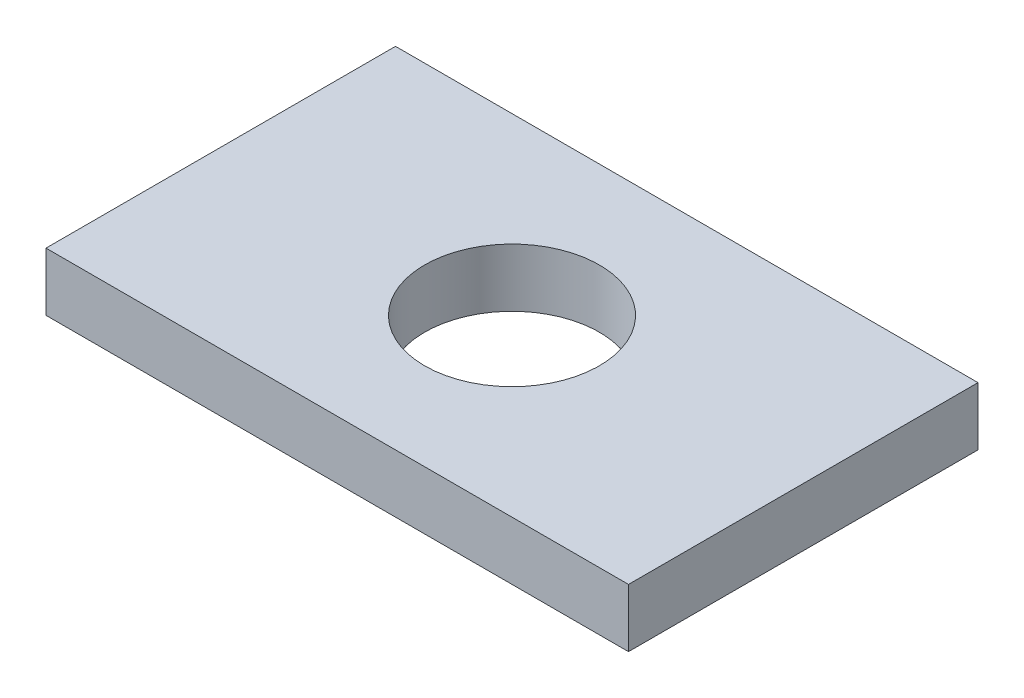
ISO-10303-21;
HEADER;
FILE_DESCRIPTION(('STEP AP214'),'2;1');
FILE_NAME('part.step','',(''),(''),'','','');
FILE_SCHEMA(('AUTOMOTIVE_DESIGN { 1 0 10303 214 1 1 1 1 }'));
ENDSEC;
DATA;
#1=APPLICATION_CONTEXT('core data for automotive mechanical design processes');
#2=APPLICATION_PROTOCOL_DEFINITION('international standard','automotive_design',2000,#1);
#3=PRODUCT_CONTEXT('',#1,'mechanical');
#4=PRODUCT('Part','Part','',(#3));
#5=PRODUCT_RELATED_PRODUCT_CATEGORY('part','',(#4));
#6=PRODUCT_DEFINITION_FORMATION('','',#4);
#7=PRODUCT_DEFINITION_CONTEXT('part definition',#1,'design');
#8=PRODUCT_DEFINITION('design','',#6,#7);
#9=PRODUCT_DEFINITION_SHAPE('','',#8);
#10=(LENGTH_UNIT() NAMED_UNIT(*) SI_UNIT(.MILLI.,.METRE.));
#11=(NAMED_UNIT(*) PLANE_ANGLE_UNIT() SI_UNIT($,.RADIAN.));
#12=(NAMED_UNIT(*) SI_UNIT($,.STERADIAN.) SOLID_ANGLE_UNIT());
#13=UNCERTAINTY_MEASURE_WITH_UNIT(LENGTH_MEASURE(1.E-05),#10,'distance_accuracy_value','');
#14=(GEOMETRIC_REPRESENTATION_CONTEXT(3) GLOBAL_UNCERTAINTY_ASSIGNED_CONTEXT((#13)) GLOBAL_UNIT_ASSIGNED_CONTEXT((#10,
#11,#12)) REPRESENTATION_CONTEXT('',''));
#15=CARTESIAN_POINT('',(0.,0.,0.));
#16=DIRECTION('',(0.,0.,1.));
#17=DIRECTION('',(1.,0.,0.));
#18=AXIS2_PLACEMENT_3D('',#15,#16,#17);
#19=CARTESIAN_POINT('',(0.,2.,0.));
#20=DIRECTION('',(0.,-1.,0.));
#21=DIRECTION('',(0.,0.,-1.));
#22=AXIS2_PLACEMENT_3D('',#19,#20,#21);
#23=PLANE('',#22);
#24=DIRECTION('',(0.,0.,1.));
#25=VECTOR('',#24,1.);
#26=CARTESIAN_POINT('',(0.,2.,0.));
#27=LINE('',#26,#25);
#28=CARTESIAN_POINT('',(0.,2.,-12.));
#29=VERTEX_POINT('',#28);
#30=CARTESIAN_POINT('',(0.,2.,0.));
#31=VERTEX_POINT('',#30);
#32=EDGE_CURVE('E85',#29,#31,#27,.T.);
#33=ORIENTED_EDGE('',*,*,#32,.T.);
#34=DIRECTION('',(1.,0.,0.));
#35=VECTOR('',#34,1.);
#36=CARTESIAN_POINT('',(0.,2.,0.));
#37=LINE('',#36,#35);
#38=CARTESIAN_POINT('',(20.,2.,0.));
#39=VERTEX_POINT('',#38);
#40=EDGE_CURVE('E80',#31,#39,#37,.T.);
#41=ORIENTED_EDGE('',*,*,#40,.T.);
#42=DIRECTION('',(0.,0.,-1.));
#43=VECTOR('',#42,1.);
#44=CARTESIAN_POINT('',(20.,2.,0.));
#45=LINE('',#44,#43);
#46=CARTESIAN_POINT('',(20.,2.,-12.));
#47=VERTEX_POINT('',#46);
#48=EDGE_CURVE('E83',#39,#47,#45,.T.);
#49=ORIENTED_EDGE('',*,*,#48,.T.);
#50=DIRECTION('',(-1.,0.,0.));
#51=VECTOR('',#50,1.);
#52=CARTESIAN_POINT('',(0.,2.,-12.));
#53=LINE('',#52,#51);
#54=EDGE_CURVE('E50',#47,#29,#53,.T.);
#55=ORIENTED_EDGE('',*,*,#54,.T.);
#56=EDGE_LOOP('',(#33,#41,#49,#55));
#57=FACE_BOUND('',#56,.T.);
#58=CARTESIAN_POINT('',(10.,2.,-6.));
#59=DIRECTION('',(0.,1.,0.));
#60=DIRECTION('',(0.,0.,1.));
#61=AXIS2_PLACEMENT_3D('',#58,#59,#60);
#62=CIRCLE('',#61,3.);
#63=CARTESIAN_POINT('',(10.,2.,-3.));
#64=VERTEX_POINT('',#63);
#65=EDGE_CURVE('E100',#64,#64,#62,.T.);
#66=ORIENTED_EDGE('',*,*,#65,.F.);
#67=EDGE_LOOP('',(#66));
#68=FACE_BOUND('',#67,.T.);
#69=ADVANCED_FACE('F33',(#57,#68),#23,.F.);
#70=CARTESIAN_POINT('',(0.,0.,0.));
#71=DIRECTION('',(0.,-1.,0.));
#72=DIRECTION('',(0.,0.,-1.));
#73=AXIS2_PLACEMENT_3D('',#70,#71,#72);
#74=PLANE('',#73);
#75=DIRECTION('',(0.,0.,1.));
#76=VECTOR('',#75,1.);
#77=CARTESIAN_POINT('',(0.,0.,0.));
#78=LINE('',#77,#76);
#79=CARTESIAN_POINT('',(0.,0.,-12.));
#80=VERTEX_POINT('',#79);
#81=CARTESIAN_POINT('',(0.,0.,0.));
#82=VERTEX_POINT('',#81);
#83=EDGE_CURVE('E97',#80,#82,#78,.T.);
#84=ORIENTED_EDGE('',*,*,#83,.F.);
#85=DIRECTION('',(-1.,0.,0.));
#86=VECTOR('',#85,1.);
#87=CARTESIAN_POINT('',(0.,0.,-12.));
#88=LINE('',#87,#86);
#89=CARTESIAN_POINT('',(20.,0.,-12.));
#90=VERTEX_POINT('',#89);
#91=EDGE_CURVE('E73',#90,#80,#88,.T.);
#92=ORIENTED_EDGE('',*,*,#91,.F.);
#93=DIRECTION('',(0.,0.,-1.));
#94=VECTOR('',#93,1.);
#95=CARTESIAN_POINT('',(20.,0.,0.));
#96=LINE('',#95,#94);
#97=CARTESIAN_POINT('',(20.,0.,0.));
#98=VERTEX_POINT('',#97);
#99=EDGE_CURVE('E67',#98,#90,#96,.T.);
#100=ORIENTED_EDGE('',*,*,#99,.F.);
#101=DIRECTION('',(1.,0.,0.));
#102=VECTOR('',#101,1.);
#103=CARTESIAN_POINT('',(0.,0.,0.));
#104=LINE('',#103,#102);
#105=EDGE_CURVE('E89',#82,#98,#104,.T.);
#106=ORIENTED_EDGE('',*,*,#105,.F.);
#107=EDGE_LOOP('',(#84,#92,#100,#106));
#108=FACE_BOUND('',#107,.T.);
#109=CARTESIAN_POINT('',(10.,0.,-6.));
#110=DIRECTION('',(0.,1.,0.));
#111=DIRECTION('',(0.,0.,1.));
#112=AXIS2_PLACEMENT_3D('',#109,#110,#111);
#113=CIRCLE('',#112,3.);
#114=CARTESIAN_POINT('',(10.,0.,-3.));
#115=VERTEX_POINT('',#114);
#116=EDGE_CURVE('E112',#115,#115,#113,.T.);
#117=ORIENTED_EDGE('',*,*,#116,.T.);
#118=EDGE_LOOP('',(#117));
#119=FACE_BOUND('',#118,.T.);
#120=ADVANCED_FACE('F108',(#108,#119),#74,.T.);
#121=CARTESIAN_POINT('',(0.,2.,0.));
#122=DIRECTION('',(1.,0.,0.));
#123=DIRECTION('',(0.,0.,-1.));
#124=AXIS2_PLACEMENT_3D('',#121,#122,#123);
#125=PLANE('',#124);
#126=ORIENTED_EDGE('',*,*,#83,.T.);
#127=DIRECTION('',(0.,-1.,0.));
#128=VECTOR('',#127,1.);
#129=CARTESIAN_POINT('',(0.,2.,0.));
#130=LINE('',#129,#128);
#131=EDGE_CURVE('E11',#31,#82,#130,.T.);
#132=ORIENTED_EDGE('',*,*,#131,.F.);
#133=ORIENTED_EDGE('',*,*,#32,.F.);
#134=DIRECTION('',(0.,-1.,0.));
#135=VECTOR('',#134,1.);
#136=CARTESIAN_POINT('',(0.,2.,-12.));
#137=LINE('',#136,#135);
#138=EDGE_CURVE('E93',#29,#80,#137,.T.);
#139=ORIENTED_EDGE('',*,*,#138,.T.);
#140=EDGE_LOOP('',(#126,#132,#133,#139));
#141=FACE_BOUND('',#140,.T.);
#142=ADVANCED_FACE('F35',(#141),#125,.F.);
#143=CARTESIAN_POINT('',(0.,2.,0.));
#144=DIRECTION('',(0.,0.,-1.));
#145=DIRECTION('',(-1.,0.,0.));
#146=AXIS2_PLACEMENT_3D('',#143,#144,#145);
#147=PLANE('',#146);
#148=ORIENTED_EDGE('',*,*,#105,.T.);
#149=DIRECTION('',(0.,-1.,0.));
#150=VECTOR('',#149,1.);
#151=CARTESIAN_POINT('',(20.,2.,0.));
#152=LINE('',#151,#150);
#153=EDGE_CURVE('E42',#39,#98,#152,.T.);
#154=ORIENTED_EDGE('',*,*,#153,.F.);
#155=ORIENTED_EDGE('',*,*,#40,.F.);
#156=ORIENTED_EDGE('',*,*,#131,.T.);
#157=EDGE_LOOP('',(#148,#154,#155,#156));
#158=FACE_BOUND('',#157,.T.);
#159=ADVANCED_FACE('F88',(#158),#147,.F.);
#160=CARTESIAN_POINT('',(20.,2.,0.));
#161=DIRECTION('',(-1.,0.,0.));
#162=DIRECTION('',(0.,0.,1.));
#163=AXIS2_PLACEMENT_3D('',#160,#161,#162);
#164=PLANE('',#163);
#165=ORIENTED_EDGE('',*,*,#99,.T.);
#166=DIRECTION('',(0.,-1.,0.));
#167=VECTOR('',#166,1.);
#168=CARTESIAN_POINT('',(20.,2.,-12.));
#169=LINE('',#168,#167);
#170=EDGE_CURVE('E90',#47,#90,#169,.T.);
#171=ORIENTED_EDGE('',*,*,#170,.F.);
#172=ORIENTED_EDGE('',*,*,#48,.F.);
#173=ORIENTED_EDGE('',*,*,#153,.T.);
#174=EDGE_LOOP('',(#165,#171,#172,#173));
#175=FACE_BOUND('',#174,.T.);
#176=ADVANCED_FACE('F91',(#175),#164,.F.);
#177=CARTESIAN_POINT('',(0.,2.,-12.));
#178=DIRECTION('',(0.,0.,1.));
#179=DIRECTION('',(1.,0.,0.));
#180=AXIS2_PLACEMENT_3D('',#177,#178,#179);
#181=PLANE('',#180);
#182=ORIENTED_EDGE('',*,*,#91,.T.);
#183=ORIENTED_EDGE('',*,*,#138,.F.);
#184=ORIENTED_EDGE('',*,*,#54,.F.);
#185=ORIENTED_EDGE('',*,*,#170,.T.);
#186=EDGE_LOOP('',(#182,#183,#184,#185));
#187=FACE_BOUND('',#186,.T.);
#188=ADVANCED_FACE('F105',(#187),#181,.F.);
#189=CARTESIAN_POINT('',(10.,2.,-6.));
#190=DIRECTION('',(0.,-1.,0.));
#191=DIRECTION('',(0.,0.,-1.));
#192=AXIS2_PLACEMENT_3D('',#189,#190,#191);
#193=CYLINDRICAL_SURFACE('',#192,3.);
#194=ORIENTED_EDGE('',*,*,#65,.T.);
#195=EDGE_LOOP('',(#194));
#196=FACE_BOUND('',#195,.T.);
#197=ORIENTED_EDGE('',*,*,#116,.F.);
#198=EDGE_LOOP('',(#197));
#199=FACE_BOUND('',#198,.T.);
#200=ADVANCED_FACE('F118',(#196,#199),#193,.F.);
#201=CLOSED_SHELL('',(#69,#120,#142,#159,#176,#188,#200));
#202=MANIFOLD_SOLID_BREP('B2',#201);
#203=ADVANCED_BREP_SHAPE_REPRESENTATION('',(#18,#202),#14);
#204=SHAPE_DEFINITION_REPRESENTATION(#9,#203);
ENDSEC;
END-ISO-10303-21;
